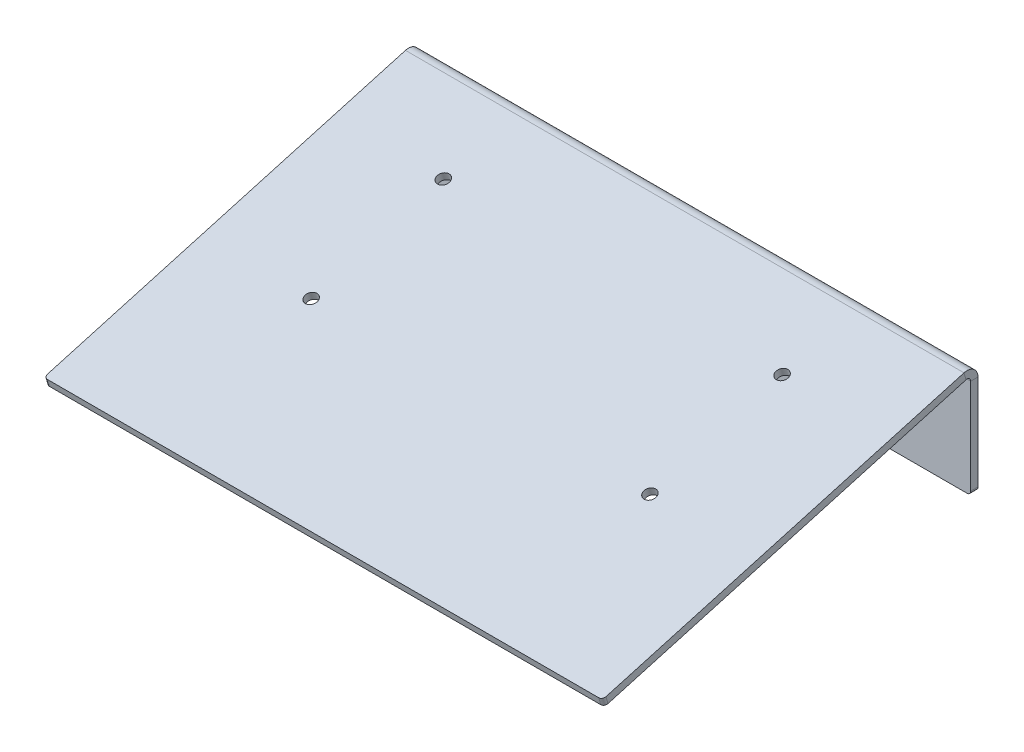
ISO-10303-21;
HEADER;
FILE_DESCRIPTION(('STEP AP214'),'2;1');
FILE_NAME('part.step','',(''),(''),'','','');
FILE_SCHEMA(('AUTOMOTIVE_DESIGN { 1 0 10303 214 1 1 1 1 }'));
ENDSEC;
DATA;
#1=APPLICATION_CONTEXT('core data for automotive mechanical design processes');
#2=APPLICATION_PROTOCOL_DEFINITION('international standard','automotive_design',2000,#1);
#3=PRODUCT_CONTEXT('',#1,'mechanical');
#4=PRODUCT('Part','Part','',(#3));
#5=PRODUCT_RELATED_PRODUCT_CATEGORY('part','',(#4));
#6=PRODUCT_DEFINITION_FORMATION('','',#4);
#7=PRODUCT_DEFINITION_CONTEXT('part definition',#1,'design');
#8=PRODUCT_DEFINITION('design','',#6,#7);
#9=PRODUCT_DEFINITION_SHAPE('','',#8);
#10=(LENGTH_UNIT() NAMED_UNIT(*) SI_UNIT(.MILLI.,.METRE.));
#11=(NAMED_UNIT(*) PLANE_ANGLE_UNIT() SI_UNIT($,.RADIAN.));
#12=(NAMED_UNIT(*) SI_UNIT($,.STERADIAN.) SOLID_ANGLE_UNIT());
#13=UNCERTAINTY_MEASURE_WITH_UNIT(LENGTH_MEASURE(1.E-05),#10,'distance_accuracy_value','');
#14=(GEOMETRIC_REPRESENTATION_CONTEXT(3) GLOBAL_UNCERTAINTY_ASSIGNED_CONTEXT((#13)) GLOBAL_UNIT_ASSIGNED_CONTEXT((#10,
#11,#12)) REPRESENTATION_CONTEXT('',''));
#15=CARTESIAN_POINT('',(0.,0.,0.));
#16=DIRECTION('',(0.,0.,1.));
#17=DIRECTION('',(1.,0.,0.));
#18=AXIS2_PLACEMENT_3D('',#15,#16,#17);
#19=CARTESIAN_POINT('',(152.5,0.,0.));
#20=DIRECTION('',(0.,1.,0.));
#21=DIRECTION('',(-1.,0.,0.));
#22=AXIS2_PLACEMENT_3D('',#19,#20,#21);
#23=PLANE('',#22);
#24=DIRECTION('',(1.,0.,0.));
#25=VECTOR('',#24,1.);
#26=CARTESIAN_POINT('',(152.5,0.,-4.));
#27=LINE('',#26,#25);
#28=CARTESIAN_POINT('',(150.5,0.,-4.));
#29=VERTEX_POINT('',#28);
#30=CARTESIAN_POINT('',(-150.5,0.,-4.));
#31=VERTEX_POINT('',#30);
#32=EDGE_CURVE('E205',#29,#31,#27,.F.);
#33=ORIENTED_EDGE('',*,*,#32,.F.);
#34=DIRECTION('',(0.,0.,1.));
#35=VECTOR('',#34,1.);
#36=CARTESIAN_POINT('',(150.5,0.,0.));
#37=LINE('',#36,#35);
#38=CARTESIAN_POINT('',(150.5,0.,0.));
#39=VERTEX_POINT('',#38);
#40=EDGE_CURVE('E217',#29,#39,#37,.T.);
#41=ORIENTED_EDGE('',*,*,#40,.T.);
#42=DIRECTION('',(-1.,0.,0.));
#43=VECTOR('',#42,1.);
#44=CARTESIAN_POINT('',(152.5,0.,0.));
#45=LINE('',#44,#43);
#46=CARTESIAN_POINT('',(-150.5,0.,0.));
#47=VERTEX_POINT('',#46);
#48=EDGE_CURVE('E144',#39,#47,#45,.T.);
#49=ORIENTED_EDGE('',*,*,#48,.T.);
#50=DIRECTION('',(0.,0.,-1.));
#51=VECTOR('',#50,1.);
#52=CARTESIAN_POINT('',(-150.5,0.,0.));
#53=LINE('',#52,#51);
#54=EDGE_CURVE('E155',#47,#31,#53,.T.);
#55=ORIENTED_EDGE('',*,*,#54,.T.);
#56=EDGE_LOOP('',(#33,#41,#49,#55));
#57=FACE_BOUND('',#56,.T.);
#58=ADVANCED_FACE('F39',(#57),#23,.F.);
#59=CARTESIAN_POINT('',(152.5,54.,0.));
#60=DIRECTION('',(1.,0.,0.));
#61=DIRECTION('',(0.,1.,0.));
#62=AXIS2_PLACEMENT_3D('',#59,#60,#61);
#63=PLANE('',#62);
#64=DIRECTION('',(0.,1.,0.));
#65=VECTOR('',#64,1.);
#66=CARTESIAN_POINT('',(152.5,54.,0.));
#67=LINE('',#66,#65);
#68=CARTESIAN_POINT('',(152.5,2.,0.));
#69=VERTEX_POINT('',#68);
#70=CARTESIAN_POINT('',(152.5,54.,0.));
#71=VERTEX_POINT('',#70);
#72=EDGE_CURVE('E134',#69,#71,#67,.T.);
#73=ORIENTED_EDGE('',*,*,#72,.F.);
#74=DIRECTION('',(0.,0.,-1.));
#75=VECTOR('',#74,1.);
#76=CARTESIAN_POINT('',(152.5,2.,0.));
#77=LINE('',#76,#75);
#78=CARTESIAN_POINT('',(152.5,2.,-4.));
#79=VERTEX_POINT('',#78);
#80=EDGE_CURVE('E223',#69,#79,#77,.T.);
#81=ORIENTED_EDGE('',*,*,#80,.T.);
#82=DIRECTION('',(0.,-1.,0.));
#83=VECTOR('',#82,1.);
#84=CARTESIAN_POINT('',(152.5,54.,-4.));
#85=LINE('',#84,#83);
#86=CARTESIAN_POINT('',(152.5,54.,-4.));
#87=VERTEX_POINT('',#86);
#88=EDGE_CURVE('E151',#79,#87,#85,.F.);
#89=ORIENTED_EDGE('',*,*,#88,.T.);
#90=DIRECTION('',(0.,0.,1.));
#91=VECTOR('',#90,1.);
#92=CARTESIAN_POINT('',(152.5,54.,0.));
#93=LINE('',#92,#91);
#94=EDGE_CURVE('E147',#87,#71,#93,.T.);
#95=ORIENTED_EDGE('',*,*,#94,.T.);
#96=EDGE_LOOP('',(#73,#81,#89,#95));
#97=FACE_BOUND('',#96,.T.);
#98=ADVANCED_FACE('F149',(#97),#63,.T.);
#99=CARTESIAN_POINT('',(152.5,54.,2.));
#100=DIRECTION('',(-1.,0.,0.));
#101=DIRECTION('',(0.,0.,1.));
#102=AXIS2_PLACEMENT_3D('',#99,#100,#101);
#103=PLANE('',#102);
#104=ORIENTED_EDGE('',*,*,#94,.F.);
#105=CARTESIAN_POINT('',(152.5,54.,2.));
#106=DIRECTION('',(-1.,0.,0.));
#107=DIRECTION('',(0.,0.,1.));
#108=AXIS2_PLACEMENT_3D('',#105,#106,#107);
#109=CIRCLE('',#108,5.99999999999999);
#110=CARTESIAN_POINT('',(152.5,59.7729234440283,3.63503972715922));
#111=VERTEX_POINT('',#110);
#112=EDGE_CURVE('E196',#87,#111,#109,.F.);
#113=ORIENTED_EDGE('',*,*,#112,.T.);
#114=DIRECTION('',(0.,-0.962153907338043,-0.272506621193204));
#115=VECTOR('',#114,1.);
#116=CARTESIAN_POINT('',(152.5,55.9243078146761,2.54501324238641));
#117=LINE('',#116,#115);
#118=CARTESIAN_POINT('',(152.5,55.9243078146761,2.54501324238641));
#119=VERTEX_POINT('',#118);
#120=EDGE_CURVE('E156',#111,#119,#117,.T.);
#121=ORIENTED_EDGE('',*,*,#120,.T.);
#122=CARTESIAN_POINT('',(152.5,54.,2.));
#123=DIRECTION('',(1.,0.,0.));
#124=DIRECTION('',(0.,0.,-1.));
#125=AXIS2_PLACEMENT_3D('',#122,#123,#124);
#126=CIRCLE('',#125,1.99999999999999);
#127=EDGE_CURVE('E159',#71,#119,#126,.T.);
#128=ORIENTED_EDGE('',*,*,#127,.F.);
#129=EDGE_LOOP('',(#104,#113,#121,#128));
#130=FACE_BOUND('',#129,.T.);
#131=ADVANCED_FACE('F160',(#130),#103,.F.);
#132=CARTESIAN_POINT('',(152.5,55.9243078146761,2.54501324238641));
#133=DIRECTION('',(1.,0.,0.));
#134=DIRECTION('',(0.,-0.272506621193204,0.962153907338043));
#135=AXIS2_PLACEMENT_3D('',#132,#133,#134);
#136=PLANE('',#135);
#137=DIRECTION('',(0.,0.272506621193204,-0.962153907338043));
#138=VECTOR('',#137,1.);
#139=CARTESIAN_POINT('',(152.5,59.7729234440283,3.63503972715922));
#140=LINE('',#139,#138);
#141=CARTESIAN_POINT('',(152.5,4.3936288717386,199.165718670097));
#142=VERTEX_POINT('',#141);
#143=EDGE_CURVE('E192',#111,#142,#140,.F.);
#144=ORIENTED_EDGE('',*,*,#143,.T.);
#145=DIRECTION('',(0.,-0.962153907338043,-0.272506621193204));
#146=VECTOR('',#145,1.);
#147=CARTESIAN_POINT('',(152.5,0.545013242386427,198.075692185324));
#148=LINE('',#147,#146);
#149=CARTESIAN_POINT('',(152.5,0.545013242386427,198.075692185324));
#150=VERTEX_POINT('',#149);
#151=EDGE_CURVE('E11',#142,#150,#148,.T.);
#152=ORIENTED_EDGE('',*,*,#151,.T.);
#153=DIRECTION('',(0.,-0.272506621193204,0.962153907338043));
#154=VECTOR('',#153,1.);
#155=CARTESIAN_POINT('',(152.5,55.9243078146761,2.54501324238641));
#156=LINE('',#155,#154);
#157=EDGE_CURVE('E178',#119,#150,#156,.T.);
#158=ORIENTED_EDGE('',*,*,#157,.F.);
#159=ORIENTED_EDGE('',*,*,#120,.F.);
#160=EDGE_LOOP('',(#144,#152,#158,#159));
#161=FACE_BOUND('',#160,.T.);
#162=ADVANCED_FACE('F307',(#161),#136,.T.);
#163=CARTESIAN_POINT('',(152.5,0.,200.));
#164=DIRECTION('',(0.,-0.272506621193204,0.962153907338043));
#165=DIRECTION('',(-1.,0.,0.));
#166=AXIS2_PLACEMENT_3D('',#163,#164,#165);
#167=PLANE('',#166);
#168=DIRECTION('',(1.,0.,0.));
#169=VECTOR('',#168,1.);
#170=CARTESIAN_POINT('',(152.5,3.84861562935217,201.090026484773));
#171=LINE('',#170,#169);
#172=CARTESIAN_POINT('',(150.5,3.84861562935217,201.090026484773));
#173=VERTEX_POINT('',#172);
#174=CARTESIAN_POINT('',(-150.5,3.84861562935217,201.090026484773));
#175=VERTEX_POINT('',#174);
#176=EDGE_CURVE('E197',#173,#175,#171,.F.);
#177=ORIENTED_EDGE('',*,*,#176,.T.);
#178=DIRECTION('',(0.,0.962153907338043,0.272506621193204));
#179=VECTOR('',#178,1.);
#180=CARTESIAN_POINT('',(-150.5,0.,200.));
#181=LINE('',#180,#179);
#182=CARTESIAN_POINT('',(-150.5,0.,200.));
#183=VERTEX_POINT('',#182);
#184=EDGE_CURVE('E234',#175,#183,#181,.F.);
#185=ORIENTED_EDGE('',*,*,#184,.T.);
#186=DIRECTION('',(-1.,0.,0.));
#187=VECTOR('',#186,1.);
#188=CARTESIAN_POINT('',(152.5,0.,200.));
#189=LINE('',#188,#187);
#190=CARTESIAN_POINT('',(150.5,0.,200.));
#191=VERTEX_POINT('',#190);
#192=EDGE_CURVE('E181',#191,#183,#189,.T.);
#193=ORIENTED_EDGE('',*,*,#192,.F.);
#194=DIRECTION('',(0.,-0.962153907338043,-0.272506621193204));
#195=VECTOR('',#194,1.);
#196=CARTESIAN_POINT('',(150.5,0.,200.));
#197=LINE('',#196,#195);
#198=EDGE_CURVE('E232',#191,#173,#197,.F.);
#199=ORIENTED_EDGE('',*,*,#198,.T.);
#200=EDGE_LOOP('',(#177,#185,#193,#199));
#201=FACE_BOUND('',#200,.T.);
#202=ADVANCED_FACE('F314',(#201),#167,.T.);
#203=CARTESIAN_POINT('',(-152.5,55.9243078146761,2.54501324238641));
#204=DIRECTION('',(1.,0.,0.));
#205=DIRECTION('',(0.,-0.272506621193204,0.962153907338043));
#206=AXIS2_PLACEMENT_3D('',#203,#204,#205);
#207=PLANE('',#206);
#208=DIRECTION('',(0.,-0.272506621193204,0.962153907338043));
#209=VECTOR('',#208,1.);
#210=CARTESIAN_POINT('',(-152.5,55.9243078146761,2.54501324238641));
#211=LINE('',#210,#209);
#212=CARTESIAN_POINT('',(-152.5,55.9243078146761,2.54501324238641));
#213=VERTEX_POINT('',#212);
#214=CARTESIAN_POINT('',(-152.5,0.545013242386413,198.075692185324));
#215=VERTEX_POINT('',#214);
#216=EDGE_CURVE('E171',#213,#215,#211,.T.);
#217=ORIENTED_EDGE('',*,*,#216,.T.);
#218=DIRECTION('',(0.,-0.962153907338043,-0.272506621193204));
#219=VECTOR('',#218,1.);
#220=CARTESIAN_POINT('',(-152.5,0.545013242386406,198.075692185324));
#221=LINE('',#220,#219);
#222=CARTESIAN_POINT('',(-152.5,4.39362887173859,199.165718670097));
#223=VERTEX_POINT('',#222);
#224=EDGE_CURVE('E64',#215,#223,#221,.F.);
#225=ORIENTED_EDGE('',*,*,#224,.T.);
#226=DIRECTION('',(0.,0.272506621193204,-0.962153907338043));
#227=VECTOR('',#226,1.);
#228=CARTESIAN_POINT('',(-152.5,59.7729234440283,3.63503972715922));
#229=LINE('',#228,#227);
#230=CARTESIAN_POINT('',(-152.5,59.7729234440283,3.63503972715922));
#231=VERTEX_POINT('',#230);
#232=EDGE_CURVE('E188',#231,#223,#229,.F.);
#233=ORIENTED_EDGE('',*,*,#232,.F.);
#234=DIRECTION('',(0.,-0.962153907338044,-0.272506621193203));
#235=VECTOR('',#234,1.);
#236=CARTESIAN_POINT('',(-152.5,55.9243078146761,2.54501324238641));
#237=LINE('',#236,#235);
#238=EDGE_CURVE('E211',#231,#213,#237,.T.);
#239=ORIENTED_EDGE('',*,*,#238,.T.);
#240=EDGE_LOOP('',(#217,#225,#233,#239));
#241=FACE_BOUND('',#240,.T.);
#242=ADVANCED_FACE('F318',(#241),#207,.F.);
#243=CARTESIAN_POINT('',(-152.5,54.,2.));
#244=DIRECTION('',(-1.,0.,0.));
#245=DIRECTION('',(0.,0.,1.));
#246=AXIS2_PLACEMENT_3D('',#243,#244,#245);
#247=PLANE('',#246);
#248=ORIENTED_EDGE('',*,*,#238,.F.);
#249=CARTESIAN_POINT('',(-152.5,54.,2.));
#250=DIRECTION('',(-1.,0.,0.));
#251=DIRECTION('',(0.,0.,1.));
#252=AXIS2_PLACEMENT_3D('',#249,#250,#251);
#253=CIRCLE('',#252,5.99999999999999);
#254=CARTESIAN_POINT('',(-152.5,54.,-3.99999999999999));
#255=VERTEX_POINT('',#254);
#256=EDGE_CURVE('E193',#255,#231,#253,.F.);
#257=ORIENTED_EDGE('',*,*,#256,.F.);
#258=DIRECTION('',(0.,0.,1.));
#259=VECTOR('',#258,1.);
#260=CARTESIAN_POINT('',(-152.5,54.,0.));
#261=LINE('',#260,#259);
#262=CARTESIAN_POINT('',(-152.5,54.,0.));
#263=VERTEX_POINT('',#262);
#264=EDGE_CURVE('E165',#255,#263,#261,.T.);
#265=ORIENTED_EDGE('',*,*,#264,.T.);
#266=CARTESIAN_POINT('',(-152.5,54.,2.));
#267=DIRECTION('',(1.,0.,0.));
#268=DIRECTION('',(0.,0.,-1.));
#269=AXIS2_PLACEMENT_3D('',#266,#267,#268);
#270=CIRCLE('',#269,1.99999999999999);
#271=EDGE_CURVE('E166',#263,#213,#270,.T.);
#272=ORIENTED_EDGE('',*,*,#271,.T.);
#273=EDGE_LOOP('',(#248,#257,#265,#272));
#274=FACE_BOUND('',#273,.T.);
#275=ADVANCED_FACE('F301',(#274),#247,.T.);
#276=CARTESIAN_POINT('',(-152.5,54.,0.));
#277=DIRECTION('',(1.,0.,0.));
#278=DIRECTION('',(0.,1.,0.));
#279=AXIS2_PLACEMENT_3D('',#276,#277,#278);
#280=PLANE('',#279);
#281=DIRECTION('',(0.,-1.,0.));
#282=VECTOR('',#281,1.);
#283=CARTESIAN_POINT('',(-152.5,54.,-4.));
#284=LINE('',#283,#282);
#285=CARTESIAN_POINT('',(-152.5,2.,-4.));
#286=VERTEX_POINT('',#285);
#287=EDGE_CURVE('E208',#286,#255,#284,.F.);
#288=ORIENTED_EDGE('',*,*,#287,.F.);
#289=DIRECTION('',(0.,0.,-1.));
#290=VECTOR('',#289,1.);
#291=CARTESIAN_POINT('',(-152.5,2.,0.));
#292=LINE('',#291,#290);
#293=CARTESIAN_POINT('',(-152.5,2.,0.));
#294=VERTEX_POINT('',#293);
#295=EDGE_CURVE('E229',#286,#294,#292,.F.);
#296=ORIENTED_EDGE('',*,*,#295,.T.);
#297=DIRECTION('',(0.,1.,0.));
#298=VECTOR('',#297,1.);
#299=CARTESIAN_POINT('',(-152.5,54.,0.));
#300=LINE('',#299,#298);
#301=EDGE_CURVE('E203',#294,#263,#300,.T.);
#302=ORIENTED_EDGE('',*,*,#301,.T.);
#303=ORIENTED_EDGE('',*,*,#264,.F.);
#304=EDGE_LOOP('',(#288,#296,#302,#303));
#305=FACE_BOUND('',#304,.T.);
#306=ADVANCED_FACE('F294',(#305),#280,.F.);
#307=CARTESIAN_POINT('',(152.5,54.,2.));
#308=DIRECTION('',(-1.,0.,0.));
#309=DIRECTION('',(0.,0.,1.));
#310=AXIS2_PLACEMENT_3D('',#307,#308,#309);
#311=CYLINDRICAL_SURFACE('',#310,1.99999999999999);
#312=ORIENTED_EDGE('',*,*,#271,.F.);
#313=DIRECTION('',(-1.,0.,0.));
#314=VECTOR('',#313,1.);
#315=CARTESIAN_POINT('',(152.5,54.,0.));
#316=LINE('',#315,#314);
#317=EDGE_CURVE('E140',#71,#263,#316,.T.);
#318=ORIENTED_EDGE('',*,*,#317,.F.);
#319=ORIENTED_EDGE('',*,*,#127,.T.);
#320=DIRECTION('',(-1.,0.,0.));
#321=VECTOR('',#320,1.);
#322=CARTESIAN_POINT('',(152.5,55.9243078146761,2.54501324238641));
#323=LINE('',#322,#321);
#324=EDGE_CURVE('E173',#119,#213,#323,.T.);
#325=ORIENTED_EDGE('',*,*,#324,.T.);
#326=EDGE_LOOP('',(#312,#318,#319,#325));
#327=FACE_BOUND('',#326,.T.);
#328=ADVANCED_FACE('F169',(#327),#311,.F.);
#329=CARTESIAN_POINT('',(152.5,55.9243078146761,2.54501324238641));
#330=DIRECTION('',(0.,-0.962153907338043,-0.272506621193204));
#331=DIRECTION('',(0.,0.272506621193204,-0.962153907338043));
#332=AXIS2_PLACEMENT_3D('',#329,#330,#331);
#333=PLANE('',#332);
#334=CARTESIAN_POINT('',(-92.5,24.3386411129704,114.06623977206));
#335=DIRECTION('',(0.,-0.962153907338043,-0.272506621193204));
#336=DIRECTION('',(0.,-0.272506621193204,0.962153907338043));
#337=AXIS2_PLACEMENT_3D('',#334,#335,#336);
#338=ELLIPSE('',#337,3.2500145140124,3.24999999999999);
#339=CARTESIAN_POINT('',(-92.5,23.452990638928,117.193253935623));
#340=VERTEX_POINT('',#339);
#341=EDGE_CURVE('E254',#340,#340,#338,.T.);
#342=ORIENTED_EDGE('',*,*,#341,.F.);
#343=EDGE_LOOP('',(#342));
#344=FACE_BOUND('',#343,.T.);
#345=CARTESIAN_POINT('',(-92.5,44.7767289754872,41.9043744590819));
#346=DIRECTION('',(0.,-0.962153907338043,-0.272506621193204));
#347=DIRECTION('',(0.,-0.272506621193204,0.962153907338043));
#348=AXIS2_PLACEMENT_3D('',#345,#346,#347);
#349=ELLIPSE('',#348,3.2500145140124,3.24999999999999);
#350=CARTESIAN_POINT('',(-92.5,43.8910785014448,45.0313886226442));
#351=VERTEX_POINT('',#350);
#352=EDGE_CURVE('E251',#351,#351,#349,.T.);
#353=ORIENTED_EDGE('',*,*,#352,.F.);
#354=EDGE_LOOP('',(#353));
#355=FACE_BOUND('',#354,.T.);
#356=CARTESIAN_POINT('',(92.5,24.3386411129704,114.06623977206));
#357=DIRECTION('',(0.,-0.962153907338043,-0.272506621193204));
#358=DIRECTION('',(0.,-0.272506621193204,0.962153907338043));
#359=AXIS2_PLACEMENT_3D('',#356,#357,#358);
#360=ELLIPSE('',#359,3.2500145140124,3.24999999999999);
#361=CARTESIAN_POINT('',(92.5,23.452990638928,117.193253935623));
#362=VERTEX_POINT('',#361);
#363=EDGE_CURVE('E248',#362,#362,#360,.T.);
#364=ORIENTED_EDGE('',*,*,#363,.F.);
#365=EDGE_LOOP('',(#364));
#366=FACE_BOUND('',#365,.T.);
#367=CARTESIAN_POINT('',(92.5,44.7767289754872,41.9043744590819));
#368=DIRECTION('',(0.,-0.962153907338043,-0.272506621193204));
#369=DIRECTION('',(0.,-0.272506621193204,0.962153907338043));
#370=AXIS2_PLACEMENT_3D('',#367,#368,#369);
#371=ELLIPSE('',#370,3.2500145140124,3.24999999999999);
#372=CARTESIAN_POINT('',(92.5,43.8910785014448,45.0313886226442));
#373=VERTEX_POINT('',#372);
#374=EDGE_CURVE('E244',#373,#373,#371,.T.);
#375=ORIENTED_EDGE('',*,*,#374,.F.);
#376=EDGE_LOOP('',(#375));
#377=FACE_BOUND('',#376,.T.);
#378=ORIENTED_EDGE('',*,*,#192,.T.);
#379=CARTESIAN_POINT('',(-150.5,0.545013242386407,198.075692185324));
#380=DIRECTION('',(0.,-0.962153907338043,-0.272506621193204));
#381=DIRECTION('',(0.,0.272506621193204,-0.962153907338043));
#382=AXIS2_PLACEMENT_3D('',#379,#380,#381);
#383=CIRCLE('',#382,2.);
#384=EDGE_CURVE('E239',#183,#215,#383,.T.);
#385=ORIENTED_EDGE('',*,*,#384,.T.);
#386=ORIENTED_EDGE('',*,*,#216,.F.);
#387=ORIENTED_EDGE('',*,*,#324,.F.);
#388=ORIENTED_EDGE('',*,*,#157,.T.);
#389=CARTESIAN_POINT('',(150.5,0.545013242386413,198.075692185324));
#390=DIRECTION('',(0.,-0.962153907338043,-0.272506621193204));
#391=DIRECTION('',(0.,0.272506621193204,-0.962153907338043));
#392=AXIS2_PLACEMENT_3D('',#389,#390,#391);
#393=CIRCLE('',#392,2.);
#394=EDGE_CURVE('E237',#150,#191,#393,.T.);
#395=ORIENTED_EDGE('',*,*,#394,.T.);
#396=EDGE_LOOP('',(#378,#385,#386,#387,#388,#395));
#397=FACE_BOUND('',#396,.T.);
#398=ADVANCED_FACE('F312',(#344,#355,#366,#377,#397),#333,.T.);
#399=CARTESIAN_POINT('',(152.5,54.,0.));
#400=DIRECTION('',(0.,0.,1.));
#401=DIRECTION('',(0.,-1.,0.));
#402=AXIS2_PLACEMENT_3D('',#399,#400,#401);
#403=PLANE('',#402);
#404=CARTESIAN_POINT('',(-87.5,30.,0.));
#405=DIRECTION('',(0.,0.,1.));
#406=DIRECTION('',(0.,-1.,0.));
#407=AXIS2_PLACEMENT_3D('',#404,#405,#406);
#408=CIRCLE('',#407,3.24999999999996);
#409=CARTESIAN_POINT('',(-87.5,26.75,0.));
#410=VERTEX_POINT('',#409);
#411=EDGE_CURVE('E272',#410,#410,#408,.T.);
#412=ORIENTED_EDGE('',*,*,#411,.F.);
#413=EDGE_LOOP('',(#412));
#414=FACE_BOUND('',#413,.T.);
#415=CARTESIAN_POINT('',(87.5,30.,0.));
#416=DIRECTION('',(0.,0.,1.));
#417=DIRECTION('',(0.,-1.,0.));
#418=AXIS2_PLACEMENT_3D('',#415,#416,#417);
#419=CIRCLE('',#418,3.24999999999996);
#420=CARTESIAN_POINT('',(87.5,26.75,0.));
#421=VERTEX_POINT('',#420);
#422=EDGE_CURVE('E210',#421,#421,#419,.T.);
#423=ORIENTED_EDGE('',*,*,#422,.F.);
#424=EDGE_LOOP('',(#423));
#425=FACE_BOUND('',#424,.T.);
#426=ORIENTED_EDGE('',*,*,#48,.F.);
#427=CARTESIAN_POINT('',(150.5,2.,0.));
#428=DIRECTION('',(0.,0.,1.));
#429=DIRECTION('',(0.,-1.,0.));
#430=AXIS2_PLACEMENT_3D('',#427,#428,#429);
#431=CIRCLE('',#430,2.);
#432=EDGE_CURVE('E141',#39,#69,#431,.T.);
#433=ORIENTED_EDGE('',*,*,#432,.T.);
#434=ORIENTED_EDGE('',*,*,#72,.T.);
#435=ORIENTED_EDGE('',*,*,#317,.T.);
#436=ORIENTED_EDGE('',*,*,#301,.F.);
#437=CARTESIAN_POINT('',(-150.5,2.,0.));
#438=DIRECTION('',(0.,0.,1.));
#439=DIRECTION('',(0.,-1.,0.));
#440=AXIS2_PLACEMENT_3D('',#437,#438,#439);
#441=CIRCLE('',#440,2.);
#442=EDGE_CURVE('E220',#294,#47,#441,.T.);
#443=ORIENTED_EDGE('',*,*,#442,.T.);
#444=EDGE_LOOP('',(#426,#433,#434,#435,#436,#443));
#445=FACE_BOUND('',#444,.T.);
#446=ADVANCED_FACE('F137',(#414,#425,#445),#403,.T.);
#447=CARTESIAN_POINT('',(152.5,54.,2.));
#448=DIRECTION('',(-1.,0.,0.));
#449=DIRECTION('',(0.,0.,1.));
#450=AXIS2_PLACEMENT_3D('',#447,#448,#449);
#451=CYLINDRICAL_SURFACE('',#450,5.99999999999999);
#452=ORIENTED_EDGE('',*,*,#256,.T.);
#453=DIRECTION('',(-1.,0.,0.));
#454=VECTOR('',#453,1.);
#455=CARTESIAN_POINT('',(152.5,59.7729234440283,3.63503972715922));
#456=LINE('',#455,#454);
#457=EDGE_CURVE('E189',#111,#231,#456,.T.);
#458=ORIENTED_EDGE('',*,*,#457,.F.);
#459=ORIENTED_EDGE('',*,*,#112,.F.);
#460=DIRECTION('',(1.,0.,0.));
#461=VECTOR('',#460,1.);
#462=CARTESIAN_POINT('',(152.5,54.,-4.));
#463=LINE('',#462,#461);
#464=EDGE_CURVE('E185',#87,#255,#463,.F.);
#465=ORIENTED_EDGE('',*,*,#464,.T.);
#466=EDGE_LOOP('',(#452,#458,#459,#465));
#467=FACE_BOUND('',#466,.T.);
#468=ADVANCED_FACE('F299',(#467),#451,.T.);
#469=CARTESIAN_POINT('',(152.5,59.7729234440283,3.63503972715922));
#470=DIRECTION('',(0.,-0.962153907338043,-0.272506621193204));
#471=DIRECTION('',(0.,0.272506621193204,-0.962153907338043));
#472=AXIS2_PLACEMENT_3D('',#469,#470,#471);
#473=PLANE('',#472);
#474=CARTESIAN_POINT('',(-92.5,28.1905143936385,115.144764290647));
#475=DIRECTION('',(0.,-0.962153907338043,-0.272506621193204));
#476=DIRECTION('',(0.,-0.272506621193204,0.962153907338043));
#477=AXIS2_PLACEMENT_3D('',#474,#475,#476);
#478=ELLIPSE('',#477,3.2500145140124,3.24999999999999);
#479=CARTESIAN_POINT('',(-92.5,27.3048639195961,118.27177845421));
#480=VERTEX_POINT('',#479);
#481=EDGE_CURVE('E43',#480,#480,#478,.T.);
#482=ORIENTED_EDGE('',*,*,#481,.T.);
#483=EDGE_LOOP('',(#482));
#484=FACE_BOUND('',#483,.T.);
#485=CARTESIAN_POINT('',(-92.5,48.6286022561553,42.9828989776689));
#486=DIRECTION('',(0.,-0.962153907338043,-0.272506621193204));
#487=DIRECTION('',(0.,-0.272506621193204,0.962153907338043));
#488=AXIS2_PLACEMENT_3D('',#485,#486,#487);
#489=ELLIPSE('',#488,3.2500145140124,3.24999999999999);
#490=CARTESIAN_POINT('',(-92.5,47.7429517821129,46.1099131412313));
#491=VERTEX_POINT('',#490);
#492=EDGE_CURVE('E252',#491,#491,#489,.T.);
#493=ORIENTED_EDGE('',*,*,#492,.T.);
#494=EDGE_LOOP('',(#493));
#495=FACE_BOUND('',#494,.T.);
#496=CARTESIAN_POINT('',(92.5,28.1905143936385,115.144764290647));
#497=DIRECTION('',(0.,-0.962153907338043,-0.272506621193204));
#498=DIRECTION('',(0.,-0.272506621193204,0.962153907338043));
#499=AXIS2_PLACEMENT_3D('',#496,#497,#498);
#500=ELLIPSE('',#499,3.2500145140124,3.24999999999999);
#501=CARTESIAN_POINT('',(92.5,27.3048639195961,118.27177845421));
#502=VERTEX_POINT('',#501);
#503=EDGE_CURVE('E249',#502,#502,#500,.T.);
#504=ORIENTED_EDGE('',*,*,#503,.T.);
#505=EDGE_LOOP('',(#504));
#506=FACE_BOUND('',#505,.T.);
#507=CARTESIAN_POINT('',(92.5,48.6286022561553,42.9828989776689));
#508=DIRECTION('',(0.,-0.962153907338043,-0.272506621193204));
#509=DIRECTION('',(0.,-0.272506621193204,0.962153907338043));
#510=AXIS2_PLACEMENT_3D('',#507,#508,#509);
#511=ELLIPSE('',#510,3.2500145140124,3.24999999999999);
#512=CARTESIAN_POINT('',(92.5,47.7429517821129,46.1099131412313));
#513=VERTEX_POINT('',#512);
#514=EDGE_CURVE('E247',#513,#513,#511,.T.);
#515=ORIENTED_EDGE('',*,*,#514,.T.);
#516=EDGE_LOOP('',(#515));
#517=FACE_BOUND('',#516,.T.);
#518=ORIENTED_EDGE('',*,*,#232,.T.);
#519=CARTESIAN_POINT('',(-150.5,4.39362887173858,199.165718670097));
#520=DIRECTION('',(0.,-0.962153907338043,-0.272506621193204));
#521=DIRECTION('',(0.,0.272506621193204,-0.962153907338043));
#522=AXIS2_PLACEMENT_3D('',#519,#520,#521);
#523=CIRCLE('',#522,2.);
#524=EDGE_CURVE('E48',#223,#175,#523,.F.);
#525=ORIENTED_EDGE('',*,*,#524,.T.);
#526=ORIENTED_EDGE('',*,*,#176,.F.);
#527=CARTESIAN_POINT('',(150.5,4.3936288717386,199.165718670097));
#528=DIRECTION('',(0.,-0.962153907338043,-0.272506621193204));
#529=DIRECTION('',(0.,0.272506621193204,-0.962153907338043));
#530=AXIS2_PLACEMENT_3D('',#527,#528,#529);
#531=CIRCLE('',#530,2.);
#532=EDGE_CURVE('E56',#173,#142,#531,.F.);
#533=ORIENTED_EDGE('',*,*,#532,.T.);
#534=ORIENTED_EDGE('',*,*,#143,.F.);
#535=ORIENTED_EDGE('',*,*,#457,.T.);
#536=EDGE_LOOP('',(#518,#525,#526,#533,#534,#535));
#537=FACE_BOUND('',#536,.T.);
#538=ADVANCED_FACE('F303',(#484,#495,#506,#517,#537),#473,.F.);
#539=CARTESIAN_POINT('',(152.5,54.,-4.));
#540=DIRECTION('',(0.,0.,1.));
#541=DIRECTION('',(0.,-1.,0.));
#542=AXIS2_PLACEMENT_3D('',#539,#540,#541);
#543=PLANE('',#542);
#544=CARTESIAN_POINT('',(-87.5,30.,-4.));
#545=DIRECTION('',(0.,0.,1.));
#546=DIRECTION('',(1.,0.,0.));
#547=AXIS2_PLACEMENT_3D('',#544,#545,#546);
#548=CIRCLE('',#547,3.24999999999993);
#549=CARTESIAN_POINT('',(-84.2500000000001,30.,-4.));
#550=VERTEX_POINT('',#549);
#551=EDGE_CURVE('E269',#550,#550,#548,.T.);
#552=ORIENTED_EDGE('',*,*,#551,.T.);
#553=EDGE_LOOP('',(#552));
#554=FACE_BOUND('',#553,.T.);
#555=CARTESIAN_POINT('',(87.5,30.,-4.));
#556=DIRECTION('',(0.,0.,1.));
#557=DIRECTION('',(1.,0.,0.));
#558=AXIS2_PLACEMENT_3D('',#555,#556,#557);
#559=CIRCLE('',#558,3.24999999999993);
#560=CARTESIAN_POINT('',(90.7499999999999,30.,-4.));
#561=VERTEX_POINT('',#560);
#562=EDGE_CURVE('E275',#561,#561,#559,.T.);
#563=ORIENTED_EDGE('',*,*,#562,.T.);
#564=EDGE_LOOP('',(#563));
#565=FACE_BOUND('',#564,.T.);
#566=ORIENTED_EDGE('',*,*,#88,.F.);
#567=CARTESIAN_POINT('',(150.5,2.,-4.));
#568=DIRECTION('',(0.,0.,1.));
#569=DIRECTION('',(0.,-1.,0.));
#570=AXIS2_PLACEMENT_3D('',#567,#568,#569);
#571=CIRCLE('',#570,2.);
#572=EDGE_CURVE('E227',#79,#29,#571,.F.);
#573=ORIENTED_EDGE('',*,*,#572,.T.);
#574=ORIENTED_EDGE('',*,*,#32,.T.);
#575=CARTESIAN_POINT('',(-150.5,2.,-4.));
#576=DIRECTION('',(0.,0.,1.));
#577=DIRECTION('',(0.,-1.,0.));
#578=AXIS2_PLACEMENT_3D('',#575,#576,#577);
#579=CIRCLE('',#578,2.);
#580=EDGE_CURVE('E225',#31,#286,#579,.F.);
#581=ORIENTED_EDGE('',*,*,#580,.T.);
#582=ORIENTED_EDGE('',*,*,#287,.T.);
#583=ORIENTED_EDGE('',*,*,#464,.F.);
#584=EDGE_LOOP('',(#566,#573,#574,#581,#582,#583));
#585=FACE_BOUND('',#584,.T.);
#586=ADVANCED_FACE('F291',(#554,#565,#585),#543,.F.);
#587=CARTESIAN_POINT('',(150.5,2.,0.));
#588=DIRECTION('',(0.,0.,-1.));
#589=DIRECTION('',(0.,1.,0.));
#590=AXIS2_PLACEMENT_3D('',#587,#588,#589);
#591=CYLINDRICAL_SURFACE('',#590,2.);
#592=ORIENTED_EDGE('',*,*,#572,.F.);
#593=ORIENTED_EDGE('',*,*,#80,.F.);
#594=ORIENTED_EDGE('',*,*,#432,.F.);
#595=ORIENTED_EDGE('',*,*,#40,.F.);
#596=EDGE_LOOP('',(#592,#593,#594,#595));
#597=FACE_BOUND('',#596,.T.);
#598=ADVANCED_FACE('F337',(#597),#591,.T.);
#599=CARTESIAN_POINT('',(-150.5,2.,0.));
#600=DIRECTION('',(0.,0.,1.));
#601=DIRECTION('',(0.,-1.,0.));
#602=AXIS2_PLACEMENT_3D('',#599,#600,#601);
#603=CYLINDRICAL_SURFACE('',#602,2.);
#604=ORIENTED_EDGE('',*,*,#580,.F.);
#605=ORIENTED_EDGE('',*,*,#54,.F.);
#606=ORIENTED_EDGE('',*,*,#442,.F.);
#607=ORIENTED_EDGE('',*,*,#295,.F.);
#608=EDGE_LOOP('',(#604,#605,#606,#607));
#609=FACE_BOUND('',#608,.T.);
#610=ADVANCED_FACE('F287',(#609),#603,.T.);
#611=CARTESIAN_POINT('',(-150.5,0.545013242386407,198.075692185324));
#612=DIRECTION('',(0.,0.962153907338043,0.272506621193204));
#613=DIRECTION('',(0.,-0.272506621193204,0.962153907338043));
#614=AXIS2_PLACEMENT_3D('',#611,#612,#613);
#615=CYLINDRICAL_SURFACE('',#614,2.);
#616=ORIENTED_EDGE('',*,*,#524,.F.);
#617=ORIENTED_EDGE('',*,*,#224,.F.);
#618=ORIENTED_EDGE('',*,*,#384,.F.);
#619=ORIENTED_EDGE('',*,*,#184,.F.);
#620=EDGE_LOOP('',(#616,#617,#618,#619));
#621=FACE_BOUND('',#620,.T.);
#622=ADVANCED_FACE('F317',(#621),#615,.T.);
#623=CARTESIAN_POINT('',(150.5,0.545013242386413,198.075692185324));
#624=DIRECTION('',(0.,-0.962153907338043,-0.272506621193204));
#625=DIRECTION('',(0.,0.272506621193204,-0.962153907338043));
#626=AXIS2_PLACEMENT_3D('',#623,#624,#625);
#627=CYLINDRICAL_SURFACE('',#626,2.);
#628=ORIENTED_EDGE('',*,*,#532,.F.);
#629=ORIENTED_EDGE('',*,*,#198,.F.);
#630=ORIENTED_EDGE('',*,*,#394,.F.);
#631=ORIENTED_EDGE('',*,*,#151,.F.);
#632=EDGE_LOOP('',(#628,#629,#630,#631));
#633=FACE_BOUND('',#632,.T.);
#634=ADVANCED_FACE('F41',(#633),#627,.T.);
#635=CARTESIAN_POINT('',(87.5,30.,4.));
#636=DIRECTION('',(0.,0.,1.));
#637=DIRECTION('',(1.,0.,0.));
#638=AXIS2_PLACEMENT_3D('',#635,#636,#637);
#639=CYLINDRICAL_SURFACE('',#638,3.24999999999996);
#640=ORIENTED_EDGE('',*,*,#422,.T.);
#641=EDGE_LOOP('',(#640));
#642=FACE_BOUND('',#641,.T.);
#643=ORIENTED_EDGE('',*,*,#562,.F.);
#644=EDGE_LOOP('',(#643));
#645=FACE_BOUND('',#644,.T.);
#646=ADVANCED_FACE('F346',(#642,#645),#639,.F.);
#647=CARTESIAN_POINT('',(-87.5,30.,4.));
#648=DIRECTION('',(0.,0.,1.));
#649=DIRECTION('',(1.,0.,0.));
#650=AXIS2_PLACEMENT_3D('',#647,#648,#649);
#651=CYLINDRICAL_SURFACE('',#650,3.24999999999996);
#652=ORIENTED_EDGE('',*,*,#411,.T.);
#653=EDGE_LOOP('',(#652));
#654=FACE_BOUND('',#653,.T.);
#655=ORIENTED_EDGE('',*,*,#551,.F.);
#656=EDGE_LOOP('',(#655));
#657=FACE_BOUND('',#656,.T.);
#658=ADVANCED_FACE('F350',(#654,#657),#651,.F.);
#659=CARTESIAN_POINT('',(92.5,40.6370816319385,40.7452732028882));
#660=DIRECTION('',(0.,-0.962964019714182,-0.269629925519971));
#661=DIRECTION('',(0.,0.269629925519971,-0.962964019714182));
#662=AXIS2_PLACEMENT_3D('',#659,#660,#661);
#663=CYLINDRICAL_SURFACE('',#662,3.24999999999999);
#664=ORIENTED_EDGE('',*,*,#374,.T.);
#665=EDGE_LOOP('',(#664));
#666=FACE_BOUND('',#665,.T.);
#667=ORIENTED_EDGE('',*,*,#514,.F.);
#668=EDGE_LOOP('',(#667));
#669=FACE_BOUND('',#668,.T.);
#670=ADVANCED_FACE('F356',(#666,#669),#663,.F.);
#671=CARTESIAN_POINT('',(92.5,20.4148372179407,112.967574681452));
#672=DIRECTION('',(0.,-0.962964019714182,-0.269629925519971));
#673=DIRECTION('',(0.,0.269629925519971,-0.962964019714182));
#674=AXIS2_PLACEMENT_3D('',#671,#672,#673);
#675=CYLINDRICAL_SURFACE('',#674,3.24999999999999);
#676=ORIENTED_EDGE('',*,*,#363,.T.);
#677=EDGE_LOOP('',(#676));
#678=FACE_BOUND('',#677,.T.);
#679=ORIENTED_EDGE('',*,*,#503,.F.);
#680=EDGE_LOOP('',(#679));
#681=FACE_BOUND('',#680,.T.);
#682=ADVANCED_FACE('F496',(#678,#681),#675,.F.);
#683=CARTESIAN_POINT('',(-92.5,40.6370816319385,40.7452732028882));
#684=DIRECTION('',(0.,-0.962964019714182,-0.269629925519971));
#685=DIRECTION('',(0.,0.269629925519971,-0.962964019714182));
#686=AXIS2_PLACEMENT_3D('',#683,#684,#685);
#687=CYLINDRICAL_SURFACE('',#686,3.24999999999999);
#688=ORIENTED_EDGE('',*,*,#352,.T.);
#689=EDGE_LOOP('',(#688));
#690=FACE_BOUND('',#689,.T.);
#691=ORIENTED_EDGE('',*,*,#492,.F.);
#692=EDGE_LOOP('',(#691));
#693=FACE_BOUND('',#692,.T.);
#694=ADVANCED_FACE('F505',(#690,#693),#687,.F.);
#695=CARTESIAN_POINT('',(-92.5,20.4148372179407,112.967574681452));
#696=DIRECTION('',(0.,-0.962964019714182,-0.269629925519971));
#697=DIRECTION('',(0.,0.269629925519971,-0.962964019714182));
#698=AXIS2_PLACEMENT_3D('',#695,#696,#697);
#699=CYLINDRICAL_SURFACE('',#698,3.24999999999999);
#700=ORIENTED_EDGE('',*,*,#341,.T.);
#701=EDGE_LOOP('',(#700));
#702=FACE_BOUND('',#701,.T.);
#703=ORIENTED_EDGE('',*,*,#481,.F.);
#704=EDGE_LOOP('',(#703));
#705=FACE_BOUND('',#704,.T.);
#706=ADVANCED_FACE('F515',(#702,#705),#699,.F.);
#707=CLOSED_SHELL('',(#58,#98,#131,#162,#202,#242,#275,#306,#328,#398,#446,#468,#538,#586,#598,
#610,#622,#634,#646,#658,#670,#682,#694,#706));
#708=MANIFOLD_SOLID_BREP('B2',#707);
#709=ADVANCED_BREP_SHAPE_REPRESENTATION('',(#18,#708),#14);
#710=SHAPE_DEFINITION_REPRESENTATION(#9,#709);
ENDSEC;
END-ISO-10303-21;
